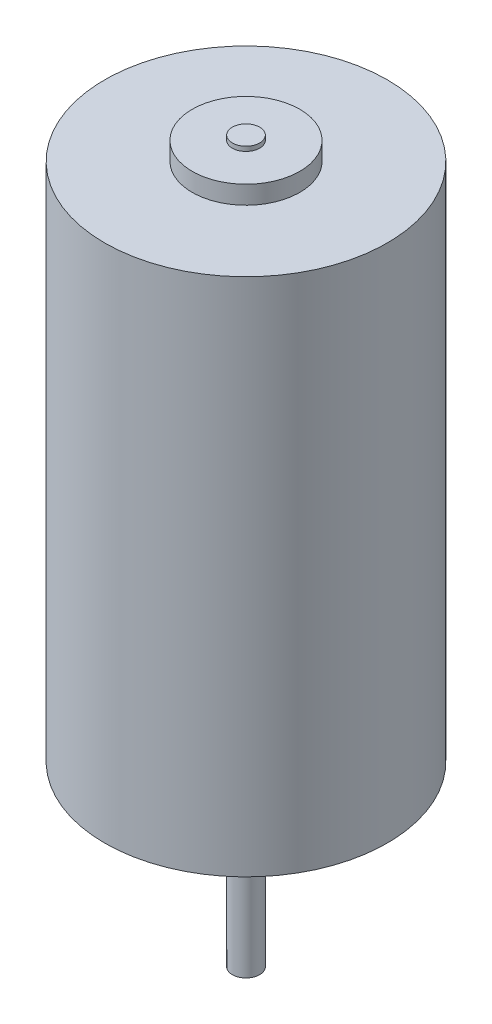
ISO-10303-21;
HEADER;
FILE_DESCRIPTION(('STEP AP214'),'2;1');
FILE_NAME('part.step','',(''),(''),'','','');
FILE_SCHEMA(('AUTOMOTIVE_DESIGN { 1 0 10303 214 1 1 1 1 }'));
ENDSEC;
DATA;
#1=APPLICATION_CONTEXT('core data for automotive mechanical design processes');
#2=APPLICATION_PROTOCOL_DEFINITION('international standard','automotive_design',2000,#1);
#3=PRODUCT_CONTEXT('',#1,'mechanical');
#4=PRODUCT('Part','Part','',(#3));
#5=PRODUCT_RELATED_PRODUCT_CATEGORY('part','',(#4));
#6=PRODUCT_DEFINITION_FORMATION('','',#4);
#7=PRODUCT_DEFINITION_CONTEXT('part definition',#1,'design');
#8=PRODUCT_DEFINITION('design','',#6,#7);
#9=PRODUCT_DEFINITION_SHAPE('','',#8);
#10=(LENGTH_UNIT() NAMED_UNIT(*) SI_UNIT(.MILLI.,.METRE.));
#11=(NAMED_UNIT(*) PLANE_ANGLE_UNIT() SI_UNIT($,.RADIAN.));
#12=(NAMED_UNIT(*) SI_UNIT($,.STERADIAN.) SOLID_ANGLE_UNIT());
#13=UNCERTAINTY_MEASURE_WITH_UNIT(LENGTH_MEASURE(1.E-05),#10,'distance_accuracy_value','');
#14=(GEOMETRIC_REPRESENTATION_CONTEXT(3) GLOBAL_UNCERTAINTY_ASSIGNED_CONTEXT((#13)) GLOBAL_UNIT_ASSIGNED_CONTEXT((#10,
#11,#12)) REPRESENTATION_CONTEXT('',''));
#15=CARTESIAN_POINT('',(0.,0.,0.));
#16=DIRECTION('',(0.,0.,1.));
#17=DIRECTION('',(1.,0.,0.));
#18=AXIS2_PLACEMENT_3D('',#15,#16,#17);
#19=CARTESIAN_POINT('',(1.5,-19.5,0.));
#20=DIRECTION('',(0.,-1.,0.));
#21=DIRECTION('',(0.,0.,-1.));
#22=AXIS2_PLACEMENT_3D('',#19,#20,#21);
#23=PLANE('',#22);
#24=CARTESIAN_POINT('',(0.,-19.5,0.));
#25=DIRECTION('',(0.,-1.,0.));
#26=DIRECTION('',(0.,0.,-1.));
#27=AXIS2_PLACEMENT_3D('',#24,#25,#26);
#28=CIRCLE('',#27,1.5);
#29=CARTESIAN_POINT('',(0.,-19.5,-1.5));
#30=VERTEX_POINT('',#29);
#31=EDGE_CURVE('E89',#30,#30,#28,.T.);
#32=ORIENTED_EDGE('',*,*,#31,.T.);
#33=EDGE_LOOP('',(#32));
#34=FACE_BOUND('',#33,.T.);
#35=ADVANCED_FACE('F36',(#34),#23,.T.);
#36=CARTESIAN_POINT('',(0.,59.5,0.));
#37=DIRECTION('',(0.,1.,0.));
#38=DIRECTION('',(0.,0.,1.));
#39=AXIS2_PLACEMENT_3D('',#36,#37,#38);
#40=PLANE('',#39);
#41=CARTESIAN_POINT('',(0.,59.5,0.));
#42=DIRECTION('',(0.,-1.,0.));
#43=DIRECTION('',(0.,0.,-1.));
#44=AXIS2_PLACEMENT_3D('',#41,#42,#43);
#45=CIRCLE('',#44,1.49999999999999);
#46=CARTESIAN_POINT('',(0.,59.5,-1.49999999999999));
#47=VERTEX_POINT('',#46);
#48=EDGE_CURVE('E11',#47,#47,#45,.T.);
#49=ORIENTED_EDGE('',*,*,#48,.F.);
#50=EDGE_LOOP('',(#49));
#51=FACE_BOUND('',#50,.T.);
#52=ADVANCED_FACE('F120',(#51),#40,.T.);
#53=CARTESIAN_POINT('',(0.,0.,0.));
#54=DIRECTION('',(0.,-1.,0.));
#55=DIRECTION('',(0.,0.,-1.));
#56=AXIS2_PLACEMENT_3D('',#53,#54,#55);
#57=CYLINDRICAL_SURFACE('',#56,1.49999999999999);
#58=ORIENTED_EDGE('',*,*,#48,.T.);
#59=EDGE_LOOP('',(#58));
#60=FACE_BOUND('',#59,.T.);
#61=CARTESIAN_POINT('',(0.,59.,0.));
#62=DIRECTION('',(0.,-1.,0.));
#63=DIRECTION('',(0.,0.,-1.));
#64=AXIS2_PLACEMENT_3D('',#61,#62,#63);
#65=CIRCLE('',#64,1.49999999999999);
#66=CARTESIAN_POINT('',(0.,59.,-1.49999999999999));
#67=VERTEX_POINT('',#66);
#68=EDGE_CURVE('E43',#67,#67,#65,.T.);
#69=ORIENTED_EDGE('',*,*,#68,.F.);
#70=EDGE_LOOP('',(#69));
#71=FACE_BOUND('',#70,.T.);
#72=ADVANCED_FACE('F118',(#60,#71),#57,.T.);
#73=CARTESIAN_POINT('',(1.49999999999999,59.,0.));
#74=DIRECTION('',(0.,1.,0.));
#75=DIRECTION('',(0.,0.,1.));
#76=AXIS2_PLACEMENT_3D('',#73,#74,#75);
#77=PLANE('',#76);
#78=ORIENTED_EDGE('',*,*,#68,.T.);
#79=EDGE_LOOP('',(#78));
#80=FACE_BOUND('',#79,.T.);
#81=CARTESIAN_POINT('',(0.,59.,0.));
#82=DIRECTION('',(0.,-1.,0.));
#83=DIRECTION('',(0.,0.,-1.));
#84=AXIS2_PLACEMENT_3D('',#81,#82,#83);
#85=CIRCLE('',#84,5.9);
#86=CARTESIAN_POINT('',(0.,59.,-5.9));
#87=VERTEX_POINT('',#86);
#88=EDGE_CURVE('E110',#87,#87,#85,.T.);
#89=ORIENTED_EDGE('',*,*,#88,.F.);
#90=EDGE_LOOP('',(#89));
#91=FACE_BOUND('',#90,.T.);
#92=ADVANCED_FACE('F115',(#80,#91),#77,.T.);
#93=CARTESIAN_POINT('',(0.,0.,0.));
#94=DIRECTION('',(0.,-1.,0.));
#95=DIRECTION('',(0.,0.,-1.));
#96=AXIS2_PLACEMENT_3D('',#93,#94,#95);
#97=CYLINDRICAL_SURFACE('',#96,5.9);
#98=ORIENTED_EDGE('',*,*,#88,.T.);
#99=EDGE_LOOP('',(#98));
#100=FACE_BOUND('',#99,.T.);
#101=CARTESIAN_POINT('',(0.,57.,0.));
#102=DIRECTION('',(0.,-1.,0.));
#103=DIRECTION('',(0.,0.,-1.));
#104=AXIS2_PLACEMENT_3D('',#101,#102,#103);
#105=CIRCLE('',#104,5.9);
#106=CARTESIAN_POINT('',(0.,57.,-5.9));
#107=VERTEX_POINT('',#106);
#108=EDGE_CURVE('E107',#107,#107,#105,.T.);
#109=ORIENTED_EDGE('',*,*,#108,.F.);
#110=EDGE_LOOP('',(#109));
#111=FACE_BOUND('',#110,.T.);
#112=ADVANCED_FACE('F127',(#100,#111),#97,.T.);
#113=CARTESIAN_POINT('',(5.9,57.,0.));
#114=DIRECTION('',(0.,1.,0.));
#115=DIRECTION('',(0.,0.,1.));
#116=AXIS2_PLACEMENT_3D('',#113,#114,#115);
#117=PLANE('',#116);
#118=ORIENTED_EDGE('',*,*,#108,.T.);
#119=EDGE_LOOP('',(#118));
#120=FACE_BOUND('',#119,.T.);
#121=CARTESIAN_POINT('',(0.,57.,0.));
#122=DIRECTION('',(0.,-1.,0.));
#123=DIRECTION('',(0.,0.,-1.));
#124=AXIS2_PLACEMENT_3D('',#121,#122,#123);
#125=CIRCLE('',#124,15.5);
#126=CARTESIAN_POINT('',(0.,57.,-15.5));
#127=VERTEX_POINT('',#126);
#128=EDGE_CURVE('E104',#127,#127,#125,.T.);
#129=ORIENTED_EDGE('',*,*,#128,.F.);
#130=EDGE_LOOP('',(#129));
#131=FACE_BOUND('',#130,.T.);
#132=ADVANCED_FACE('F163',(#120,#131),#117,.T.);
#133=CARTESIAN_POINT('',(0.,0.,0.));
#134=DIRECTION('',(0.,-1.,0.));
#135=DIRECTION('',(0.,0.,-1.));
#136=AXIS2_PLACEMENT_3D('',#133,#134,#135);
#137=CYLINDRICAL_SURFACE('',#136,15.5);
#138=ORIENTED_EDGE('',*,*,#128,.T.);
#139=EDGE_LOOP('',(#138));
#140=FACE_BOUND('',#139,.T.);
#141=CARTESIAN_POINT('',(0.,0.,0.));
#142=DIRECTION('',(0.,-1.,0.));
#143=DIRECTION('',(0.,0.,-1.));
#144=AXIS2_PLACEMENT_3D('',#141,#142,#143);
#145=CIRCLE('',#144,15.5);
#146=CARTESIAN_POINT('',(0.,0.,-15.5));
#147=VERTEX_POINT('',#146);
#148=EDGE_CURVE('E101',#147,#147,#145,.T.);
#149=ORIENTED_EDGE('',*,*,#148,.F.);
#150=EDGE_LOOP('',(#149));
#151=FACE_BOUND('',#150,.T.);
#152=ADVANCED_FACE('F159',(#140,#151),#137,.T.);
#153=CARTESIAN_POINT('',(15.5,0.,0.));
#154=DIRECTION('',(0.,-1.,0.));
#155=DIRECTION('',(0.,0.,-1.));
#156=AXIS2_PLACEMENT_3D('',#153,#154,#155);
#157=PLANE('',#156);
#158=CARTESIAN_POINT('',(0.,0.,11.));
#159=DIRECTION('',(0.,-1.,0.));
#160=DIRECTION('',(0.,0.,-1.));
#161=AXIS2_PLACEMENT_3D('',#158,#159,#160);
#162=CIRCLE('',#161,1.25);
#163=CARTESIAN_POINT('',(0.,0.,9.75));
#164=VERTEX_POINT('',#163);
#165=EDGE_CURVE('E67',#164,#164,#162,.T.);
#166=ORIENTED_EDGE('',*,*,#165,.F.);
#167=EDGE_LOOP('',(#166));
#168=FACE_BOUND('',#167,.T.);
#169=CARTESIAN_POINT('',(11.,0.,0.));
#170=DIRECTION('',(0.,-1.,0.));
#171=DIRECTION('',(0.,0.,-1.));
#172=AXIS2_PLACEMENT_3D('',#169,#170,#171);
#173=CIRCLE('',#172,1.25);
#174=CARTESIAN_POINT('',(11.,0.,-1.25));
#175=VERTEX_POINT('',#174);
#176=EDGE_CURVE('E66',#175,#175,#173,.T.);
#177=ORIENTED_EDGE('',*,*,#176,.F.);
#178=EDGE_LOOP('',(#177));
#179=FACE_BOUND('',#178,.T.);
#180=CARTESIAN_POINT('',(0.,0.,-11.));
#181=DIRECTION('',(0.,-1.,0.));
#182=DIRECTION('',(0.,0.,-1.));
#183=AXIS2_PLACEMENT_3D('',#180,#181,#182);
#184=CIRCLE('',#183,1.25);
#185=CARTESIAN_POINT('',(0.,0.,-12.25));
#186=VERTEX_POINT('',#185);
#187=EDGE_CURVE('E77',#186,#186,#184,.T.);
#188=ORIENTED_EDGE('',*,*,#187,.F.);
#189=EDGE_LOOP('',(#188));
#190=FACE_BOUND('',#189,.T.);
#191=CARTESIAN_POINT('',(-11.,0.,0.));
#192=DIRECTION('',(0.,-1.,0.));
#193=DIRECTION('',(0.,0.,-1.));
#194=AXIS2_PLACEMENT_3D('',#191,#192,#193);
#195=CIRCLE('',#194,1.25);
#196=CARTESIAN_POINT('',(-11.,0.,-1.25));
#197=VERTEX_POINT('',#196);
#198=EDGE_CURVE('E83',#197,#197,#195,.T.);
#199=ORIENTED_EDGE('',*,*,#198,.F.);
#200=EDGE_LOOP('',(#199));
#201=FACE_BOUND('',#200,.T.);
#202=ORIENTED_EDGE('',*,*,#148,.T.);
#203=EDGE_LOOP('',(#202));
#204=FACE_BOUND('',#203,.T.);
#205=CARTESIAN_POINT('',(0.,0.,0.));
#206=DIRECTION('',(0.,-1.,0.));
#207=DIRECTION('',(0.,0.,-1.));
#208=AXIS2_PLACEMENT_3D('',#205,#206,#207);
#209=CIRCLE('',#208,5.9);
#210=CARTESIAN_POINT('',(0.,0.,-5.9));
#211=VERTEX_POINT('',#210);
#212=EDGE_CURVE('E98',#211,#211,#209,.T.);
#213=ORIENTED_EDGE('',*,*,#212,.F.);
#214=EDGE_LOOP('',(#213));
#215=FACE_BOUND('',#214,.T.);
#216=ADVANCED_FACE('F155',(#168,#179,#190,#201,#204,#215),#157,.T.);
#217=CARTESIAN_POINT('',(0.,0.,0.));
#218=DIRECTION('',(0.,-1.,0.));
#219=DIRECTION('',(0.,0.,-1.));
#220=AXIS2_PLACEMENT_3D('',#217,#218,#219);
#221=CYLINDRICAL_SURFACE('',#220,5.9);
#222=ORIENTED_EDGE('',*,*,#212,.T.);
#223=EDGE_LOOP('',(#222));
#224=FACE_BOUND('',#223,.T.);
#225=CARTESIAN_POINT('',(0.,-3.,0.));
#226=DIRECTION('',(0.,-1.,0.));
#227=DIRECTION('',(0.,0.,-1.));
#228=AXIS2_PLACEMENT_3D('',#225,#226,#227);
#229=CIRCLE('',#228,5.9);
#230=CARTESIAN_POINT('',(0.,-3.,-5.9));
#231=VERTEX_POINT('',#230);
#232=EDGE_CURVE('E95',#231,#231,#229,.T.);
#233=ORIENTED_EDGE('',*,*,#232,.F.);
#234=EDGE_LOOP('',(#233));
#235=FACE_BOUND('',#234,.T.);
#236=ADVANCED_FACE('F148',(#224,#235),#221,.T.);
#237=CARTESIAN_POINT('',(1.5,-3.,0.));
#238=DIRECTION('',(0.,-1.,0.));
#239=DIRECTION('',(0.,0.,-1.));
#240=AXIS2_PLACEMENT_3D('',#237,#238,#239);
#241=PLANE('',#240);
#242=ORIENTED_EDGE('',*,*,#232,.T.);
#243=EDGE_LOOP('',(#242));
#244=FACE_BOUND('',#243,.T.);
#245=CARTESIAN_POINT('',(0.,-3.,0.));
#246=DIRECTION('',(0.,-1.,0.));
#247=DIRECTION('',(0.,0.,-1.));
#248=AXIS2_PLACEMENT_3D('',#245,#246,#247);
#249=CIRCLE('',#248,1.5);
#250=CARTESIAN_POINT('',(0.,-3.,-1.5));
#251=VERTEX_POINT('',#250);
#252=EDGE_CURVE('E92',#251,#251,#249,.T.);
#253=ORIENTED_EDGE('',*,*,#252,.F.);
#254=EDGE_LOOP('',(#253));
#255=FACE_BOUND('',#254,.T.);
#256=ADVANCED_FACE('F139',(#244,#255),#241,.T.);
#257=CARTESIAN_POINT('',(0.,0.,0.));
#258=DIRECTION('',(0.,-1.,0.));
#259=DIRECTION('',(0.,0.,-1.));
#260=AXIS2_PLACEMENT_3D('',#257,#258,#259);
#261=CYLINDRICAL_SURFACE('',#260,1.5);
#262=ORIENTED_EDGE('',*,*,#252,.T.);
#263=EDGE_LOOP('',(#262));
#264=FACE_BOUND('',#263,.T.);
#265=ORIENTED_EDGE('',*,*,#31,.F.);
#266=EDGE_LOOP('',(#265));
#267=FACE_BOUND('',#266,.T.);
#268=ADVANCED_FACE('F136',(#264,#267),#261,.T.);
#269=CARTESIAN_POINT('',(-11.,8.5,0.));
#270=DIRECTION('',(0.,-1.,0.));
#271=DIRECTION('',(0.,0.,-1.));
#272=AXIS2_PLACEMENT_3D('',#269,#270,#271);
#273=CONICAL_SURFACE('',#272,1.25,1.02974425867665);
#274=CARTESIAN_POINT('',(-11.,9.25107577378445,0.));
#275=VERTEX_POINT('',#274);
#276=VERTEX_LOOP('',#275);
#277=FACE_BOUND('',#276,.T.);
#278=CARTESIAN_POINT('',(-11.,8.5,0.));
#279=DIRECTION('',(0.,-1.,0.));
#280=DIRECTION('',(0.,0.,-1.));
#281=AXIS2_PLACEMENT_3D('',#278,#279,#280);
#282=CIRCLE('',#281,1.25);
#283=CARTESIAN_POINT('',(-11.,8.5,-1.25));
#284=VERTEX_POINT('',#283);
#285=EDGE_CURVE('E86',#284,#284,#282,.T.);
#286=ORIENTED_EDGE('',*,*,#285,.T.);
#287=EDGE_LOOP('',(#286));
#288=FACE_BOUND('',#287,.T.);
#289=ADVANCED_FACE('F138',(#277,#288),#273,.F.);
#290=CARTESIAN_POINT('',(-11.,0.,0.));
#291=DIRECTION('',(0.,-1.,0.));
#292=DIRECTION('',(0.,0.,-1.));
#293=AXIS2_PLACEMENT_3D('',#290,#291,#292);
#294=CYLINDRICAL_SURFACE('',#293,1.25);
#295=ORIENTED_EDGE('',*,*,#285,.F.);
#296=EDGE_LOOP('',(#295));
#297=FACE_BOUND('',#296,.T.);
#298=ORIENTED_EDGE('',*,*,#198,.T.);
#299=EDGE_LOOP('',(#298));
#300=FACE_BOUND('',#299,.T.);
#301=ADVANCED_FACE('F146',(#297,#300),#294,.F.);
#302=CARTESIAN_POINT('',(0.,8.5,-11.));
#303=DIRECTION('',(0.,-1.,0.));
#304=DIRECTION('',(0.,0.,-1.));
#305=AXIS2_PLACEMENT_3D('',#302,#303,#304);
#306=CONICAL_SURFACE('',#305,1.25,1.02974425867665);
#307=CARTESIAN_POINT('',(0.,9.25107577378445,-11.));
#308=VERTEX_POINT('',#307);
#309=VERTEX_LOOP('',#308);
#310=FACE_BOUND('',#309,.T.);
#311=CARTESIAN_POINT('',(0.,8.5,-11.));
#312=DIRECTION('',(0.,-1.,0.));
#313=DIRECTION('',(0.,0.,-1.));
#314=AXIS2_PLACEMENT_3D('',#311,#312,#313);
#315=CIRCLE('',#314,1.25);
#316=CARTESIAN_POINT('',(0.,8.5,-12.25));
#317=VERTEX_POINT('',#316);
#318=EDGE_CURVE('E80',#317,#317,#315,.T.);
#319=ORIENTED_EDGE('',*,*,#318,.T.);
#320=EDGE_LOOP('',(#319));
#321=FACE_BOUND('',#320,.T.);
#322=ADVANCED_FACE('F227',(#310,#321),#306,.F.);
#323=CARTESIAN_POINT('',(0.,0.,-11.));
#324=DIRECTION('',(0.,-1.,0.));
#325=DIRECTION('',(0.,0.,-1.));
#326=AXIS2_PLACEMENT_3D('',#323,#324,#325);
#327=CYLINDRICAL_SURFACE('',#326,1.25);
#328=ORIENTED_EDGE('',*,*,#318,.F.);
#329=EDGE_LOOP('',(#328));
#330=FACE_BOUND('',#329,.T.);
#331=ORIENTED_EDGE('',*,*,#187,.T.);
#332=EDGE_LOOP('',(#331));
#333=FACE_BOUND('',#332,.T.);
#334=ADVANCED_FACE('F236',(#330,#333),#327,.F.);
#335=CARTESIAN_POINT('',(11.,8.5,0.));
#336=DIRECTION('',(0.,-1.,0.));
#337=DIRECTION('',(0.,0.,-1.));
#338=AXIS2_PLACEMENT_3D('',#335,#336,#337);
#339=CONICAL_SURFACE('',#338,1.25,1.02974425867665);
#340=CARTESIAN_POINT('',(11.,9.25107577378445,0.));
#341=VERTEX_POINT('',#340);
#342=VERTEX_LOOP('',#341);
#343=FACE_BOUND('',#342,.T.);
#344=CARTESIAN_POINT('',(11.,8.5,0.));
#345=DIRECTION('',(0.,-1.,0.));
#346=DIRECTION('',(0.,0.,-1.));
#347=AXIS2_PLACEMENT_3D('',#344,#345,#346);
#348=CIRCLE('',#347,1.25);
#349=CARTESIAN_POINT('',(11.,8.5,-1.25));
#350=VERTEX_POINT('',#349);
#351=EDGE_CURVE('E70',#350,#350,#348,.T.);
#352=ORIENTED_EDGE('',*,*,#351,.T.);
#353=EDGE_LOOP('',(#352));
#354=FACE_BOUND('',#353,.T.);
#355=ADVANCED_FACE('F244',(#343,#354),#339,.F.);
#356=CARTESIAN_POINT('',(11.,0.,0.));
#357=DIRECTION('',(0.,-1.,0.));
#358=DIRECTION('',(0.,0.,-1.));
#359=AXIS2_PLACEMENT_3D('',#356,#357,#358);
#360=CYLINDRICAL_SURFACE('',#359,1.25);
#361=ORIENTED_EDGE('',*,*,#351,.F.);
#362=EDGE_LOOP('',(#361));
#363=FACE_BOUND('',#362,.T.);
#364=ORIENTED_EDGE('',*,*,#176,.T.);
#365=EDGE_LOOP('',(#364));
#366=FACE_BOUND('',#365,.T.);
#367=ADVANCED_FACE('F60',(#363,#366),#360,.F.);
#368=CARTESIAN_POINT('',(0.,8.5,11.));
#369=DIRECTION('',(0.,-1.,0.));
#370=DIRECTION('',(0.,0.,-1.));
#371=AXIS2_PLACEMENT_3D('',#368,#369,#370);
#372=CONICAL_SURFACE('',#371,1.25,1.02974425867665);
#373=CARTESIAN_POINT('',(0.,9.25107577378445,11.));
#374=VERTEX_POINT('',#373);
#375=VERTEX_LOOP('',#374);
#376=FACE_BOUND('',#375,.T.);
#377=CARTESIAN_POINT('',(0.,8.5,11.));
#378=DIRECTION('',(0.,-1.,0.));
#379=DIRECTION('',(0.,0.,-1.));
#380=AXIS2_PLACEMENT_3D('',#377,#378,#379);
#381=CIRCLE('',#380,1.25);
#382=CARTESIAN_POINT('',(0.,8.5,9.75));
#383=VERTEX_POINT('',#382);
#384=EDGE_CURVE('E64',#383,#383,#381,.T.);
#385=ORIENTED_EDGE('',*,*,#384,.T.);
#386=EDGE_LOOP('',(#385));
#387=FACE_BOUND('',#386,.T.);
#388=ADVANCED_FACE('F56',(#376,#387),#372,.F.);
#389=CARTESIAN_POINT('',(0.,0.,11.));
#390=DIRECTION('',(0.,-1.,0.));
#391=DIRECTION('',(0.,0.,-1.));
#392=AXIS2_PLACEMENT_3D('',#389,#390,#391);
#393=CYLINDRICAL_SURFACE('',#392,1.25);
#394=ORIENTED_EDGE('',*,*,#384,.F.);
#395=EDGE_LOOP('',(#394));
#396=FACE_BOUND('',#395,.T.);
#397=ORIENTED_EDGE('',*,*,#165,.T.);
#398=EDGE_LOOP('',(#397));
#399=FACE_BOUND('',#398,.T.);
#400=ADVANCED_FACE('F59',(#396,#399),#393,.F.);
#401=CLOSED_SHELL('',(#35,#52,#72,#92,#112,#132,#152,#216,#236,#256,#268,#289,#301,#322,#334,
#355,#367,#388,#400));
#402=MANIFOLD_SOLID_BREP('B2',#401);
#403=ADVANCED_BREP_SHAPE_REPRESENTATION('',(#18,#402),#14);
#404=SHAPE_DEFINITION_REPRESENTATION(#9,#403);
ENDSEC;
END-ISO-10303-21;
